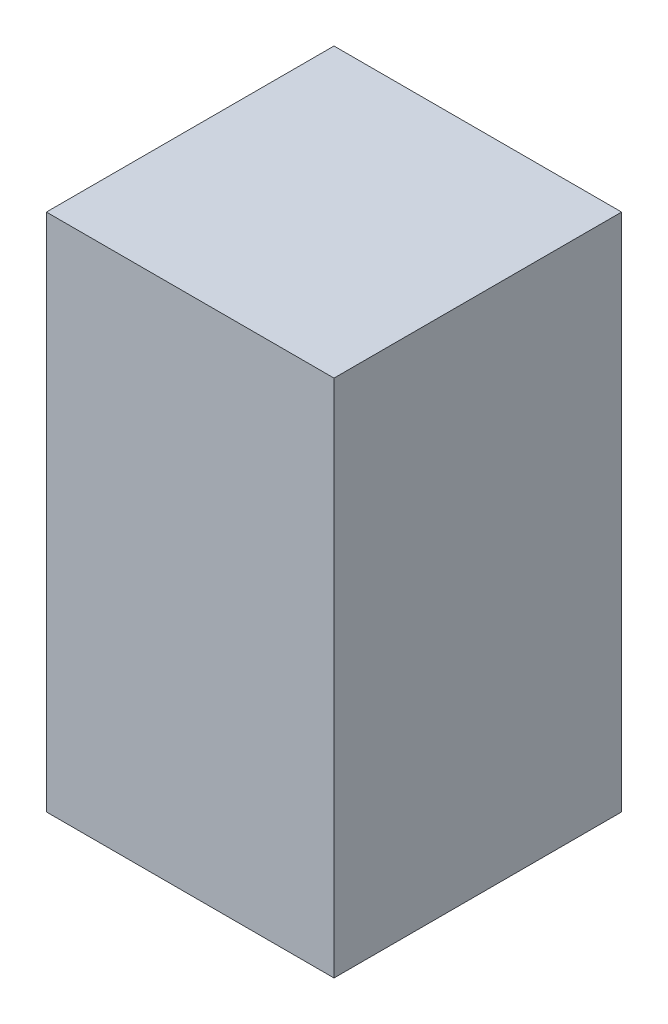
ISO-10303-21;
HEADER;
FILE_DESCRIPTION(('STEP AP214'),'2;1');
FILE_NAME('part.step','',(''),(''),'','','');
FILE_SCHEMA(('AUTOMOTIVE_DESIGN { 1 0 10303 214 1 1 1 1 }'));
ENDSEC;
DATA;
#1=APPLICATION_CONTEXT('core data for automotive mechanical design processes');
#2=APPLICATION_PROTOCOL_DEFINITION('international standard','automotive_design',2000,#1);
#3=PRODUCT_CONTEXT('',#1,'mechanical');
#4=PRODUCT('Part','Part','',(#3));
#5=PRODUCT_RELATED_PRODUCT_CATEGORY('part','',(#4));
#6=PRODUCT_DEFINITION_FORMATION('','',#4);
#7=PRODUCT_DEFINITION_CONTEXT('part definition',#1,'design');
#8=PRODUCT_DEFINITION('design','',#6,#7);
#9=PRODUCT_DEFINITION_SHAPE('','',#8);
#10=(LENGTH_UNIT() NAMED_UNIT(*) SI_UNIT(.MILLI.,.METRE.));
#11=(NAMED_UNIT(*) PLANE_ANGLE_UNIT() SI_UNIT($,.RADIAN.));
#12=(NAMED_UNIT(*) SI_UNIT($,.STERADIAN.) SOLID_ANGLE_UNIT());
#13=UNCERTAINTY_MEASURE_WITH_UNIT(LENGTH_MEASURE(1.E-05),#10,'distance_accuracy_value','');
#14=(GEOMETRIC_REPRESENTATION_CONTEXT(3) GLOBAL_UNCERTAINTY_ASSIGNED_CONTEXT((#13)) GLOBAL_UNIT_ASSIGNED_CONTEXT((#10,
#11,#12)) REPRESENTATION_CONTEXT('',''));
#15=CARTESIAN_POINT('',(0.,0.,0.));
#16=DIRECTION('',(0.,0.,1.));
#17=DIRECTION('',(1.,0.,0.));
#18=AXIS2_PLACEMENT_3D('',#15,#16,#17);
#19=CARTESIAN_POINT('',(0.,0.,0.));
#20=DIRECTION('',(0.,0.,1.));
#21=DIRECTION('',(1.,0.,0.));
#22=AXIS2_PLACEMENT_3D('',#19,#20,#21);
#23=PLANE('',#22);
#24=DIRECTION('',(0.,1.,0.));
#25=VECTOR('',#24,1.);
#26=CARTESIAN_POINT('',(610.,10.,0.));
#27=LINE('',#26,#25);
#28=CARTESIAN_POINT('',(610.,-1110.,0.));
#29=VERTEX_POINT('',#28);
#30=CARTESIAN_POINT('',(610.,10.,0.));
#31=VERTEX_POINT('',#30);
#32=EDGE_CURVE('E187',#29,#31,#27,.T.);
#33=ORIENTED_EDGE('',*,*,#32,.F.);
#34=DIRECTION('',(1.,0.,0.));
#35=VECTOR('',#34,1.);
#36=CARTESIAN_POINT('',(-10.0000000000001,-1110.,0.));
#37=LINE('',#36,#35);
#38=CARTESIAN_POINT('',(-10.0000000000001,-1110.,0.));
#39=VERTEX_POINT('',#38);
#40=EDGE_CURVE('E196',#39,#29,#37,.T.);
#41=ORIENTED_EDGE('',*,*,#40,.F.);
#42=DIRECTION('',(0.,-1.,0.));
#43=VECTOR('',#42,1.);
#44=CARTESIAN_POINT('',(-10.0000000000003,10.,0.));
#45=LINE('',#44,#43);
#46=CARTESIAN_POINT('',(-10.0000000000003,10.,0.));
#47=VERTEX_POINT('',#46);
#48=EDGE_CURVE('E120',#47,#39,#45,.T.);
#49=ORIENTED_EDGE('',*,*,#48,.F.);
#50=DIRECTION('',(-1.,0.,0.));
#51=VECTOR('',#50,1.);
#52=CARTESIAN_POINT('',(-10.0000000000003,10.,0.));
#53=LINE('',#52,#51);
#54=EDGE_CURVE('E191',#31,#47,#53,.T.);
#55=ORIENTED_EDGE('',*,*,#54,.F.);
#56=EDGE_LOOP('',(#33,#41,#49,#55));
#57=FACE_BOUND('',#56,.T.);
#58=DIRECTION('',(0.,-1.,0.));
#59=VECTOR('',#58,1.);
#60=CARTESIAN_POINT('',(0.,0.,0.));
#61=LINE('',#60,#59);
#62=CARTESIAN_POINT('',(0.,0.,0.));
#63=VERTEX_POINT('',#62);
#64=CARTESIAN_POINT('',(0.,-1100.,0.));
#65=VERTEX_POINT('',#64);
#66=EDGE_CURVE('E69',#63,#65,#61,.T.);
#67=ORIENTED_EDGE('',*,*,#66,.T.);
#68=DIRECTION('',(1.,0.,0.));
#69=VECTOR('',#68,1.);
#70=CARTESIAN_POINT('',(0.,-1100.,0.));
#71=LINE('',#70,#69);
#72=CARTESIAN_POINT('',(600.,-1100.,0.));
#73=VERTEX_POINT('',#72);
#74=EDGE_CURVE('E165',#65,#73,#71,.T.);
#75=ORIENTED_EDGE('',*,*,#74,.T.);
#76=DIRECTION('',(0.,1.,0.));
#77=VECTOR('',#76,1.);
#78=CARTESIAN_POINT('',(600.,0.,0.));
#79=LINE('',#78,#77);
#80=CARTESIAN_POINT('',(600.,0.,0.));
#81=VERTEX_POINT('',#80);
#82=EDGE_CURVE('E169',#73,#81,#79,.T.);
#83=ORIENTED_EDGE('',*,*,#82,.T.);
#84=DIRECTION('',(-1.,0.,0.));
#85=VECTOR('',#84,1.);
#86=CARTESIAN_POINT('',(0.,0.,0.));
#87=LINE('',#86,#85);
#88=EDGE_CURVE('E152',#81,#63,#87,.T.);
#89=ORIENTED_EDGE('',*,*,#88,.T.);
#90=EDGE_LOOP('',(#67,#75,#83,#89));
#91=FACE_BOUND('',#90,.T.);
#92=ADVANCED_FACE('F45',(#57,#91),#23,.F.);
#93=CARTESIAN_POINT('',(610.,10.,600.));
#94=DIRECTION('',(-1.,0.,0.));
#95=DIRECTION('',(0.,-1.,0.));
#96=AXIS2_PLACEMENT_3D('',#93,#94,#95);
#97=PLANE('',#96);
#98=ORIENTED_EDGE('',*,*,#32,.T.);
#99=DIRECTION('',(0.,0.,-1.));
#100=VECTOR('',#99,1.);
#101=CARTESIAN_POINT('',(610.,10.,600.));
#102=LINE('',#101,#100);
#103=CARTESIAN_POINT('',(610.,10.0000000000001,620.));
#104=VERTEX_POINT('',#103);
#105=EDGE_CURVE('E11',#104,#31,#102,.T.);
#106=ORIENTED_EDGE('',*,*,#105,.F.);
#107=DIRECTION('',(0.,1.,0.));
#108=VECTOR('',#107,1.);
#109=CARTESIAN_POINT('',(610.,10.0000000000001,620.));
#110=LINE('',#109,#108);
#111=CARTESIAN_POINT('',(610.,-1110.,620.));
#112=VERTEX_POINT('',#111);
#113=EDGE_CURVE('E134',#112,#104,#110,.T.);
#114=ORIENTED_EDGE('',*,*,#113,.F.);
#115=DIRECTION('',(0.,0.,-1.));
#116=VECTOR('',#115,1.);
#117=CARTESIAN_POINT('',(610.,-1110.,600.));
#118=LINE('',#117,#116);
#119=EDGE_CURVE('E124',#112,#29,#118,.T.);
#120=ORIENTED_EDGE('',*,*,#119,.T.);
#121=EDGE_LOOP('',(#98,#106,#114,#120));
#122=FACE_BOUND('',#121,.T.);
#123=ADVANCED_FACE('F47',(#122),#97,.F.);
#124=CARTESIAN_POINT('',(-10.0000000000003,10.,600.));
#125=DIRECTION('',(0.,-1.,0.));
#126=DIRECTION('',(0.,0.,-1.));
#127=AXIS2_PLACEMENT_3D('',#124,#125,#126);
#128=PLANE('',#127);
#129=ORIENTED_EDGE('',*,*,#54,.T.);
#130=DIRECTION('',(0.,0.,-1.));
#131=VECTOR('',#130,1.);
#132=CARTESIAN_POINT('',(-10.0000000000003,10.,600.));
#133=LINE('',#132,#131);
#134=CARTESIAN_POINT('',(-10.0000000000001,10.0000000000001,620.));
#135=VERTEX_POINT('',#134);
#136=EDGE_CURVE('E54',#135,#47,#133,.T.);
#137=ORIENTED_EDGE('',*,*,#136,.F.);
#138=DIRECTION('',(-1.,0.,0.));
#139=VECTOR('',#138,1.);
#140=CARTESIAN_POINT('',(-10.0000000000001,10.0000000000001,620.));
#141=LINE('',#140,#139);
#142=EDGE_CURVE('E139',#104,#135,#141,.T.);
#143=ORIENTED_EDGE('',*,*,#142,.F.);
#144=ORIENTED_EDGE('',*,*,#105,.T.);
#145=EDGE_LOOP('',(#129,#137,#143,#144));
#146=FACE_BOUND('',#145,.T.);
#147=ADVANCED_FACE('F206',(#146),#128,.F.);
#148=CARTESIAN_POINT('',(-10.0000000000003,10.,600.));
#149=DIRECTION('',(1.,0.,0.));
#150=DIRECTION('',(0.,1.,0.));
#151=AXIS2_PLACEMENT_3D('',#148,#149,#150);
#152=PLANE('',#151);
#153=ORIENTED_EDGE('',*,*,#48,.T.);
#154=DIRECTION('',(0.,0.,-1.));
#155=VECTOR('',#154,1.);
#156=CARTESIAN_POINT('',(-10.0000000000001,-1110.,600.));
#157=LINE('',#156,#155);
#158=CARTESIAN_POINT('',(-10.,-1110.,620.));
#159=VERTEX_POINT('',#158);
#160=EDGE_CURVE('E113',#159,#39,#157,.T.);
#161=ORIENTED_EDGE('',*,*,#160,.F.);
#162=DIRECTION('',(0.,-1.,0.));
#163=VECTOR('',#162,1.);
#164=CARTESIAN_POINT('',(-10.0000000000001,10.0000000000001,620.));
#165=LINE('',#164,#163);
#166=EDGE_CURVE('E118',#135,#159,#165,.T.);
#167=ORIENTED_EDGE('',*,*,#166,.F.);
#168=ORIENTED_EDGE('',*,*,#136,.T.);
#169=EDGE_LOOP('',(#153,#161,#167,#168));
#170=FACE_BOUND('',#169,.T.);
#171=ADVANCED_FACE('F115',(#170),#152,.F.);
#172=CARTESIAN_POINT('',(-10.0000000000001,-1110.,600.));
#173=DIRECTION('',(0.,1.,0.));
#174=DIRECTION('',(0.,0.,1.));
#175=AXIS2_PLACEMENT_3D('',#172,#173,#174);
#176=PLANE('',#175);
#177=ORIENTED_EDGE('',*,*,#40,.T.);
#178=ORIENTED_EDGE('',*,*,#119,.F.);
#179=DIRECTION('',(1.,0.,0.));
#180=VECTOR('',#179,1.);
#181=CARTESIAN_POINT('',(-10.,-1110.,620.));
#182=LINE('',#181,#180);
#183=EDGE_CURVE('E127',#159,#112,#182,.T.);
#184=ORIENTED_EDGE('',*,*,#183,.F.);
#185=ORIENTED_EDGE('',*,*,#160,.T.);
#186=EDGE_LOOP('',(#177,#178,#184,#185));
#187=FACE_BOUND('',#186,.T.);
#188=ADVANCED_FACE('F128',(#187),#176,.F.);
#189=CARTESIAN_POINT('',(0.,0.,600.));
#190=DIRECTION('',(1.,0.,0.));
#191=DIRECTION('',(0.,0.,-1.));
#192=AXIS2_PLACEMENT_3D('',#189,#190,#191);
#193=PLANE('',#192);
#194=ORIENTED_EDGE('',*,*,#66,.F.);
#195=DIRECTION('',(0.,0.,-1.));
#196=VECTOR('',#195,1.);
#197=CARTESIAN_POINT('',(0.,0.,600.));
#198=LINE('',#197,#196);
#199=CARTESIAN_POINT('',(0.,0.,600.));
#200=VERTEX_POINT('',#199);
#201=EDGE_CURVE('E162',#200,#63,#198,.T.);
#202=ORIENTED_EDGE('',*,*,#201,.F.);
#203=DIRECTION('',(0.,-1.,0.));
#204=VECTOR('',#203,1.);
#205=CARTESIAN_POINT('',(0.,0.,600.));
#206=LINE('',#205,#204);
#207=CARTESIAN_POINT('',(0.,-1100.,600.));
#208=VERTEX_POINT('',#207);
#209=EDGE_CURVE('E147',#200,#208,#206,.T.);
#210=ORIENTED_EDGE('',*,*,#209,.T.);
#211=DIRECTION('',(0.,0.,-1.));
#212=VECTOR('',#211,1.);
#213=CARTESIAN_POINT('',(0.,-1100.,600.));
#214=LINE('',#213,#212);
#215=EDGE_CURVE('E184',#208,#65,#214,.T.);
#216=ORIENTED_EDGE('',*,*,#215,.T.);
#217=EDGE_LOOP('',(#194,#202,#210,#216));
#218=FACE_BOUND('',#217,.T.);
#219=ADVANCED_FACE('F219',(#218),#193,.T.);
#220=CARTESIAN_POINT('',(0.,-1100.,600.));
#221=DIRECTION('',(0.,1.,0.));
#222=DIRECTION('',(0.,0.,1.));
#223=AXIS2_PLACEMENT_3D('',#220,#221,#222);
#224=PLANE('',#223);
#225=ORIENTED_EDGE('',*,*,#74,.F.);
#226=ORIENTED_EDGE('',*,*,#215,.F.);
#227=DIRECTION('',(1.,0.,0.));
#228=VECTOR('',#227,1.);
#229=CARTESIAN_POINT('',(0.,-1100.,600.));
#230=LINE('',#229,#228);
#231=CARTESIAN_POINT('',(600.,-1100.,600.));
#232=VERTEX_POINT('',#231);
#233=EDGE_CURVE('E151',#208,#232,#230,.T.);
#234=ORIENTED_EDGE('',*,*,#233,.T.);
#235=DIRECTION('',(0.,0.,-1.));
#236=VECTOR('',#235,1.);
#237=CARTESIAN_POINT('',(600.,-1100.,600.));
#238=LINE('',#237,#236);
#239=EDGE_CURVE('E181',#232,#73,#238,.T.);
#240=ORIENTED_EDGE('',*,*,#239,.T.);
#241=EDGE_LOOP('',(#225,#226,#234,#240));
#242=FACE_BOUND('',#241,.T.);
#243=ADVANCED_FACE('F225',(#242),#224,.T.);
#244=CARTESIAN_POINT('',(600.,0.,600.));
#245=DIRECTION('',(-1.,0.,0.));
#246=DIRECTION('',(0.,0.,1.));
#247=AXIS2_PLACEMENT_3D('',#244,#245,#246);
#248=PLANE('',#247);
#249=ORIENTED_EDGE('',*,*,#82,.F.);
#250=ORIENTED_EDGE('',*,*,#239,.F.);
#251=DIRECTION('',(0.,1.,0.));
#252=VECTOR('',#251,1.);
#253=CARTESIAN_POINT('',(600.,0.,600.));
#254=LINE('',#253,#252);
#255=CARTESIAN_POINT('',(600.,0.,600.));
#256=VERTEX_POINT('',#255);
#257=EDGE_CURVE('E156',#232,#256,#254,.T.);
#258=ORIENTED_EDGE('',*,*,#257,.T.);
#259=DIRECTION('',(0.,0.,-1.));
#260=VECTOR('',#259,1.);
#261=CARTESIAN_POINT('',(600.,0.,600.));
#262=LINE('',#261,#260);
#263=EDGE_CURVE('E178',#256,#81,#262,.T.);
#264=ORIENTED_EDGE('',*,*,#263,.T.);
#265=EDGE_LOOP('',(#249,#250,#258,#264));
#266=FACE_BOUND('',#265,.T.);
#267=ADVANCED_FACE('F229',(#266),#248,.T.);
#268=CARTESIAN_POINT('',(0.,0.,600.));
#269=DIRECTION('',(0.,-1.,0.));
#270=DIRECTION('',(0.,0.,-1.));
#271=AXIS2_PLACEMENT_3D('',#268,#269,#270);
#272=PLANE('',#271);
#273=ORIENTED_EDGE('',*,*,#88,.F.);
#274=ORIENTED_EDGE('',*,*,#263,.F.);
#275=DIRECTION('',(-1.,0.,0.));
#276=VECTOR('',#275,1.);
#277=CARTESIAN_POINT('',(0.,0.,600.));
#278=LINE('',#277,#276);
#279=EDGE_CURVE('E61',#256,#200,#278,.T.);
#280=ORIENTED_EDGE('',*,*,#279,.T.);
#281=ORIENTED_EDGE('',*,*,#201,.T.);
#282=EDGE_LOOP('',(#273,#274,#280,#281));
#283=FACE_BOUND('',#282,.T.);
#284=ADVANCED_FACE('F234',(#283),#272,.T.);
#285=CARTESIAN_POINT('',(0.,0.,600.));
#286=DIRECTION('',(0.,0.,1.));
#287=DIRECTION('',(1.,0.,0.));
#288=AXIS2_PLACEMENT_3D('',#285,#286,#287);
#289=PLANE('',#288);
#290=ORIENTED_EDGE('',*,*,#233,.F.);
#291=ORIENTED_EDGE('',*,*,#209,.F.);
#292=ORIENTED_EDGE('',*,*,#279,.F.);
#293=ORIENTED_EDGE('',*,*,#257,.F.);
#294=EDGE_LOOP('',(#290,#291,#292,#293));
#295=FACE_BOUND('',#294,.T.);
#296=ADVANCED_FACE('F240',(#295),#289,.F.);
#297=CARTESIAN_POINT('',(0.,0.,620.));
#298=DIRECTION('',(0.,0.,1.));
#299=DIRECTION('',(1.,0.,0.));
#300=AXIS2_PLACEMENT_3D('',#297,#298,#299);
#301=PLANE('',#300);
#302=ORIENTED_EDGE('',*,*,#166,.T.);
#303=ORIENTED_EDGE('',*,*,#183,.T.);
#304=ORIENTED_EDGE('',*,*,#113,.T.);
#305=ORIENTED_EDGE('',*,*,#142,.T.);
#306=EDGE_LOOP('',(#302,#303,#304,#305));
#307=FACE_BOUND('',#306,.T.);
#308=ADVANCED_FACE('F137',(#307),#301,.T.);
#309=CLOSED_SHELL('',(#92,#123,#147,#171,#188,#219,#243,#267,#284,#296,#308));
#310=MANIFOLD_SOLID_BREP('B2',#309);
#311=ADVANCED_BREP_SHAPE_REPRESENTATION('',(#18,#310),#14);
#312=SHAPE_DEFINITION_REPRESENTATION(#9,#311);
ENDSEC;
END-ISO-10303-21;
